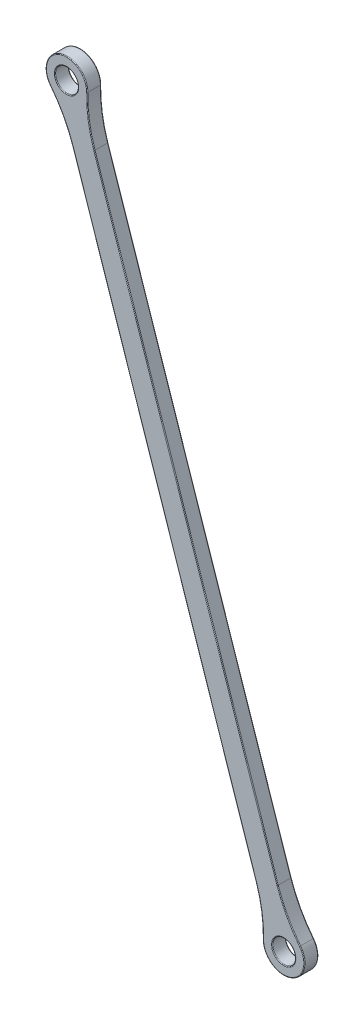
ISO-10303-21;
HEADER;
FILE_DESCRIPTION(('STEP AP214'),'2;1');
FILE_NAME('part.step','',(''),(''),'','','');
FILE_SCHEMA(('AUTOMOTIVE_DESIGN { 1 0 10303 214 1 1 1 1 }'));
ENDSEC;
DATA;
#1=APPLICATION_CONTEXT('core data for automotive mechanical design processes');
#2=APPLICATION_PROTOCOL_DEFINITION('international standard','automotive_design',2000,#1);
#3=PRODUCT_CONTEXT('',#1,'mechanical');
#4=PRODUCT('Part','Part','',(#3));
#5=PRODUCT_RELATED_PRODUCT_CATEGORY('part','',(#4));
#6=PRODUCT_DEFINITION_FORMATION('','',#4);
#7=PRODUCT_DEFINITION_CONTEXT('part definition',#1,'design');
#8=PRODUCT_DEFINITION('design','',#6,#7);
#9=PRODUCT_DEFINITION_SHAPE('','',#8);
#10=(LENGTH_UNIT() NAMED_UNIT(*) SI_UNIT(.MILLI.,.METRE.));
#11=(NAMED_UNIT(*) PLANE_ANGLE_UNIT() SI_UNIT($,.RADIAN.));
#12=(NAMED_UNIT(*) SI_UNIT($,.STERADIAN.) SOLID_ANGLE_UNIT());
#13=UNCERTAINTY_MEASURE_WITH_UNIT(LENGTH_MEASURE(1.E-05),#10,'distance_accuracy_value','');
#14=(GEOMETRIC_REPRESENTATION_CONTEXT(3) GLOBAL_UNCERTAINTY_ASSIGNED_CONTEXT((#13)) GLOBAL_UNIT_ASSIGNED_CONTEXT((#10,
#11,#12)) REPRESENTATION_CONTEXT('',''));
#15=CARTESIAN_POINT('',(0.,0.,0.));
#16=DIRECTION('',(0.,0.,1.));
#17=DIRECTION('',(1.,0.,0.));
#18=AXIS2_PLACEMENT_3D('',#15,#16,#17);
#19=CARTESIAN_POINT('',(35.2762578259127,11.8603454086036,-3.));
#20=DIRECTION('',(0.947861187581984,0.318683493572653,0.));
#21=DIRECTION('',(-0.318683493572653,0.947861187581984,0.));
#22=AXIS2_PLACEMENT_3D('',#19,#20,#21);
#23=PLANE('',#22);
#24=DIRECTION('',(0.,0.,1.));
#25=VECTOR('',#24,1.);
#26=CARTESIAN_POINT('',(-31.3457818724992,210.014460514268,-3.));
#27=LINE('',#26,#25);
#28=CARTESIAN_POINT('',(-31.3457818724992,210.014460514268,-0.15));
#29=VERTEX_POINT('',#28);
#30=CARTESIAN_POINT('',(-31.3457818724992,210.014460514268,-2.85));
#31=VERTEX_POINT('',#30);
#32=EDGE_CURVE('E262',#29,#31,#27,.F.);
#33=ORIENTED_EDGE('',*,*,#32,.T.);
#34=DIRECTION('',(-0.318683493572653,0.947861187581984,0.));
#35=VECTOR('',#34,1.);
#36=CARTESIAN_POINT('',(35.2762578259127,11.8603454086036,-2.85));
#37=LINE('',#36,#35);
#38=CARTESIAN_POINT('',(8.44131888583659,91.6755777800025,-2.85));
#39=VERTEX_POINT('',#38);
#40=EDGE_CURVE('E213',#31,#39,#37,.F.);
#41=ORIENTED_EDGE('',*,*,#40,.T.);
#42=DIRECTION('',(0.,0.,1.));
#43=VECTOR('',#42,1.);
#44=CARTESIAN_POINT('',(8.44131888583659,91.6755777800025,-3.));
#45=LINE('',#44,#43);
#46=CARTESIAN_POINT('',(8.44131888583659,91.6755777800025,-0.15));
#47=VERTEX_POINT('',#46);
#48=EDGE_CURVE('E308',#39,#47,#45,.T.);
#49=ORIENTED_EDGE('',*,*,#48,.T.);
#50=DIRECTION('',(-0.318683493572653,0.947861187581984,0.));
#51=VECTOR('',#50,1.);
#52=CARTESIAN_POINT('',(-31.3457818724993,210.014460514268,-0.15));
#53=LINE('',#52,#51);
#54=EDGE_CURVE('E211',#47,#29,#53,.T.);
#55=ORIENTED_EDGE('',*,*,#54,.T.);
#56=EDGE_LOOP('',(#33,#41,#49,#55));
#57=FACE_BOUND('',#56,.T.);
#58=ADVANCED_FACE('F35',(#57),#23,.F.);
#59=CARTESIAN_POINT('',(-32.6651570487527,221.783455762134,-3.));
#60=DIRECTION('',(0.,0.,1.));
#61=DIRECTION('',(1.,0.,0.));
#62=AXIS2_PLACEMENT_3D('',#59,#60,#61);
#63=CYLINDRICAL_SURFACE('',#62,4.5);
#64=DIRECTION('',(0.,0.,1.));
#65=VECTOR('',#64,1.);
#66=CARTESIAN_POINT('',(-28.1658722563671,221.703228852635,-3.));
#67=LINE('',#66,#65);
#68=CARTESIAN_POINT('',(-28.1658722563671,221.703228852635,-0.15));
#69=VERTEX_POINT('',#68);
#70=CARTESIAN_POINT('',(-28.1658722563671,221.703228852635,-2.85));
#71=VERTEX_POINT('',#70);
#72=EDGE_CURVE('E322',#69,#71,#67,.F.);
#73=ORIENTED_EDGE('',*,*,#72,.T.);
#74=CARTESIAN_POINT('',(-32.6651570487527,221.783455762134,-2.85));
#75=DIRECTION('',(0.,0.,1.));
#76=DIRECTION('',(1.,0.,0.));
#77=AXIS2_PLACEMENT_3D('',#74,#75,#76);
#78=CIRCLE('',#77,4.5);
#79=CARTESIAN_POINT('',(-36.2020866728231,219.001347059302,-2.85));
#80=VERTEX_POINT('',#79);
#81=EDGE_CURVE('E204',#71,#80,#78,.T.);
#82=ORIENTED_EDGE('',*,*,#81,.T.);
#83=DIRECTION('',(0.,0.,1.));
#84=VECTOR('',#83,1.);
#85=CARTESIAN_POINT('',(-36.2020866728231,219.001347059302,-3.));
#86=LINE('',#85,#84);
#87=CARTESIAN_POINT('',(-36.2020866728231,219.001347059302,-0.15));
#88=VERTEX_POINT('',#87);
#89=EDGE_CURVE('E319',#80,#88,#86,.T.);
#90=ORIENTED_EDGE('',*,*,#89,.T.);
#91=CARTESIAN_POINT('',(-32.6651570487527,221.783455762134,-0.15));
#92=DIRECTION('',(0.,0.,1.));
#93=DIRECTION('',(1.,0.,0.));
#94=AXIS2_PLACEMENT_3D('',#91,#92,#93);
#95=CIRCLE('',#94,4.5);
#96=EDGE_CURVE('E202',#88,#69,#95,.F.);
#97=ORIENTED_EDGE('',*,*,#96,.T.);
#98=EDGE_LOOP('',(#73,#82,#90,#97));
#99=FACE_BOUND('',#98,.T.);
#100=ADVANCED_FACE('F390',(#99),#63,.T.);
#101=CARTESIAN_POINT('',(40.0155637638226,13.4537628764668,-3.));
#102=DIRECTION('',(0.947861187581984,0.318683493572653,0.));
#103=DIRECTION('',(-0.318683493572653,0.947861187581984,0.));
#104=AXIS2_PLACEMENT_3D('',#101,#102,#103);
#105=PLANE('',#104);
#106=DIRECTION('',(0.,0.,-1.));
#107=VECTOR('',#106,1.);
#108=CARTESIAN_POINT('',(13.1806248237466,93.2689952478657,-3.));
#109=LINE('',#108,#107);
#110=CARTESIAN_POINT('',(13.1806248237466,93.2689952478657,-0.15));
#111=VERTEX_POINT('',#110);
#112=CARTESIAN_POINT('',(13.1806248237466,93.2689952478657,-2.85));
#113=VERTEX_POINT('',#112);
#114=EDGE_CURVE('E302',#111,#113,#109,.T.);
#115=ORIENTED_EDGE('',*,*,#114,.T.);
#116=DIRECTION('',(-0.318683493572653,0.947861187581984,0.));
#117=VECTOR('',#116,1.);
#118=CARTESIAN_POINT('',(-26.6064759345894,211.607877982131,-2.85));
#119=LINE('',#118,#117);
#120=CARTESIAN_POINT('',(-26.6064759345893,211.607877982131,-2.85));
#121=VERTEX_POINT('',#120);
#122=EDGE_CURVE('E196',#113,#121,#119,.T.);
#123=ORIENTED_EDGE('',*,*,#122,.T.);
#124=DIRECTION('',(0.,0.,-1.));
#125=VECTOR('',#124,1.);
#126=CARTESIAN_POINT('',(-26.6064759345893,211.607877982131,0.));
#127=LINE('',#126,#125);
#128=CARTESIAN_POINT('',(-26.6064759345893,211.607877982131,-0.15));
#129=VERTEX_POINT('',#128);
#130=EDGE_CURVE('E310',#121,#129,#127,.F.);
#131=ORIENTED_EDGE('',*,*,#130,.T.);
#132=DIRECTION('',(-0.318683493572653,0.947861187581984,0.));
#133=VECTOR('',#132,1.);
#134=CARTESIAN_POINT('',(40.0155637638226,13.4537628764668,-0.15));
#135=LINE('',#134,#133);
#136=EDGE_CURVE('E194',#129,#111,#135,.F.);
#137=ORIENTED_EDGE('',*,*,#136,.T.);
#138=EDGE_LOOP('',(#115,#123,#131,#137));
#139=FACE_BOUND('',#138,.T.);
#140=ADVANCED_FACE('F345',(#139),#105,.T.);
#141=CARTESIAN_POINT('',(14.5,81.5,-3.));
#142=DIRECTION('',(0.,0.,1.));
#143=DIRECTION('',(1.,0.,0.));
#144=AXIS2_PLACEMENT_3D('',#141,#142,#143);
#145=CYLINDRICAL_SURFACE('',#144,4.50000000000001);
#146=DIRECTION('',(0.,0.,1.));
#147=VECTOR('',#146,1.);
#148=CARTESIAN_POINT('',(10.0007152076144,81.5802269094986,-3.));
#149=LINE('',#148,#147);
#150=CARTESIAN_POINT('',(10.0007152076144,81.5802269094986,-0.15));
#151=VERTEX_POINT('',#150);
#152=CARTESIAN_POINT('',(10.0007152076144,81.5802269094986,-2.85));
#153=VERTEX_POINT('',#152);
#154=EDGE_CURVE('E307',#151,#153,#149,.F.);
#155=ORIENTED_EDGE('',*,*,#154,.T.);
#156=CARTESIAN_POINT('',(14.5,81.5,-2.85));
#157=DIRECTION('',(0.,0.,1.));
#158=DIRECTION('',(1.,0.,0.));
#159=AXIS2_PLACEMENT_3D('',#156,#157,#158);
#160=CIRCLE('',#159,4.50000000000001);
#161=CARTESIAN_POINT('',(18.0369296240704,84.282108702832,-2.85));
#162=VERTEX_POINT('',#161);
#163=EDGE_CURVE('E221',#153,#162,#160,.T.);
#164=ORIENTED_EDGE('',*,*,#163,.T.);
#165=DIRECTION('',(0.,0.,1.));
#166=VECTOR('',#165,1.);
#167=CARTESIAN_POINT('',(18.0369296240704,84.282108702832,-3.));
#168=LINE('',#167,#166);
#169=CARTESIAN_POINT('',(18.0369296240704,84.282108702832,-0.15));
#170=VERTEX_POINT('',#169);
#171=EDGE_CURVE('E300',#162,#170,#168,.T.);
#172=ORIENTED_EDGE('',*,*,#171,.T.);
#173=CARTESIAN_POINT('',(14.5,81.5,-0.15));
#174=DIRECTION('',(0.,0.,1.));
#175=DIRECTION('',(1.,0.,0.));
#176=AXIS2_PLACEMENT_3D('',#173,#174,#175);
#177=CIRCLE('',#176,4.50000000000001);
#178=EDGE_CURVE('E219',#170,#151,#177,.F.);
#179=ORIENTED_EDGE('',*,*,#178,.T.);
#180=EDGE_LOOP('',(#155,#164,#172,#179));
#181=FACE_BOUND('',#180,.T.);
#182=ADVANCED_FACE('F305',(#181),#145,.T.);
#183=CARTESIAN_POINT('',(-32.6651570487527,221.783455762134,-3.));
#184=DIRECTION('',(0.,0.,1.));
#185=DIRECTION('',(1.,0.,0.));
#186=AXIS2_PLACEMENT_3D('',#183,#184,#185);
#187=CYLINDRICAL_SURFACE('',#186,2.50000000000001);
#188=CARTESIAN_POINT('',(-32.6651570487527,221.783455762134,-2.85));
#189=DIRECTION('',(0.,0.,1.));
#190=DIRECTION('',(1.,0.,0.));
#191=AXIS2_PLACEMENT_3D('',#188,#189,#190);
#192=CIRCLE('',#191,2.50000000000001);
#193=CARTESIAN_POINT('',(-30.1651570487527,221.783455762134,-2.85));
#194=VERTEX_POINT('',#193);
#195=EDGE_CURVE('E226',#194,#194,#192,.F.);
#196=ORIENTED_EDGE('',*,*,#195,.T.);
#197=EDGE_LOOP('',(#196));
#198=FACE_BOUND('',#197,.T.);
#199=CARTESIAN_POINT('',(-32.6651570487527,221.783455762134,-0.15));
#200=DIRECTION('',(0.,0.,1.));
#201=DIRECTION('',(1.,0.,0.));
#202=AXIS2_PLACEMENT_3D('',#199,#200,#201);
#203=CIRCLE('',#202,2.50000000000001);
#204=CARTESIAN_POINT('',(-30.1651570487527,221.783455762134,-0.15));
#205=VERTEX_POINT('',#204);
#206=EDGE_CURVE('E223',#205,#205,#203,.T.);
#207=ORIENTED_EDGE('',*,*,#206,.T.);
#208=EDGE_LOOP('',(#207));
#209=FACE_BOUND('',#208,.T.);
#210=ADVANCED_FACE('F404',(#198,#209),#187,.F.);
#211=CARTESIAN_POINT('',(14.5,81.5,-3.));
#212=DIRECTION('',(0.,0.,1.));
#213=DIRECTION('',(1.,0.,0.));
#214=AXIS2_PLACEMENT_3D('',#211,#212,#213);
#215=CYLINDRICAL_SURFACE('',#214,2.50000000000001);
#216=CARTESIAN_POINT('',(14.5,81.5,-2.85));
#217=DIRECTION('',(0.,0.,1.));
#218=DIRECTION('',(1.,0.,0.));
#219=AXIS2_PLACEMENT_3D('',#216,#217,#218);
#220=CIRCLE('',#219,2.50000000000001);
#221=CARTESIAN_POINT('',(17.,81.5,-2.85));
#222=VERTEX_POINT('',#221);
#223=EDGE_CURVE('E188',#222,#222,#220,.F.);
#224=ORIENTED_EDGE('',*,*,#223,.T.);
#225=EDGE_LOOP('',(#224));
#226=FACE_BOUND('',#225,.T.);
#227=CARTESIAN_POINT('',(14.5,81.5,-0.15));
#228=DIRECTION('',(0.,0.,1.));
#229=DIRECTION('',(1.,0.,0.));
#230=AXIS2_PLACEMENT_3D('',#227,#228,#229);
#231=CIRCLE('',#230,2.50000000000001);
#232=CARTESIAN_POINT('',(17.,81.5,-0.15));
#233=VERTEX_POINT('',#232);
#234=EDGE_CURVE('E180',#233,#233,#231,.T.);
#235=ORIENTED_EDGE('',*,*,#234,.T.);
#236=EDGE_LOOP('',(#235));
#237=FACE_BOUND('',#236,.T.);
#238=ADVANCED_FACE('F400',(#226,#237),#215,.F.);
#239=CARTESIAN_POINT('',(0.,0.,-3.));
#240=DIRECTION('',(0.,0.,1.));
#241=DIRECTION('',(1.,0.,0.));
#242=AXIS2_PLACEMENT_3D('',#239,#240,#241);
#243=PLANE('',#242);
#244=CARTESIAN_POINT('',(14.5,81.5,-3.));
#245=DIRECTION('',(0.,0.,1.));
#246=DIRECTION('',(1.,0.,0.));
#247=AXIS2_PLACEMENT_3D('',#244,#245,#246);
#248=CIRCLE('',#247,2.65000000000001);
#249=CARTESIAN_POINT('',(17.15,81.5,-3.));
#250=VERTEX_POINT('',#249);
#251=EDGE_CURVE('E177',#250,#250,#248,.T.);
#252=ORIENTED_EDGE('',*,*,#251,.T.);
#253=EDGE_LOOP('',(#252));
#254=FACE_BOUND('',#253,.T.);
#255=DIRECTION('',(-0.318683493572653,0.947861187581984,0.));
#256=VECTOR('',#255,1.);
#257=CARTESIAN_POINT('',(13.0384456456092,93.2211927238299,-3.));
#258=LINE('',#257,#256);
#259=CARTESIAN_POINT('',(-26.7486551127266,211.560075458095,-3.));
#260=VERTEX_POINT('',#259);
#261=CARTESIAN_POINT('',(13.0384456456093,93.2211927238298,-3.));
#262=VERTEX_POINT('',#261);
#263=EDGE_CURVE('E175',#260,#262,#258,.F.);
#264=ORIENTED_EDGE('',*,*,#263,.T.);
#265=CARTESIAN_POINT('',(41.6164604512061,102.829500055045,-3.));
#266=DIRECTION('',(0.,0.,1.));
#267=DIRECTION('',(1.,0.,0.));
#268=AXIS2_PLACEMENT_3D('',#265,#266,#267);
#269=CIRCLE('',#268,30.15);
#270=CARTESIAN_POINT('',(17.9190319699347,84.1893717460709,-3.));
#271=VERTEX_POINT('',#270);
#272=EDGE_CURVE('E155',#262,#271,#269,.T.);
#273=ORIENTED_EDGE('',*,*,#272,.T.);
#274=CARTESIAN_POINT('',(14.5,81.5,-3.));
#275=DIRECTION('',(0.,0.,1.));
#276=DIRECTION('',(1.,0.,0.));
#277=AXIS2_PLACEMENT_3D('',#274,#275,#276);
#278=CIRCLE('',#277,4.35000000000001);
#279=CARTESIAN_POINT('',(10.1506913673606,81.577552679182,-3.));
#280=VERTEX_POINT('',#279);
#281=EDGE_CURVE('E163',#271,#280,#278,.F.);
#282=ORIENTED_EDGE('',*,*,#281,.T.);
#283=CARTESIAN_POINT('',(-19.9945167416229,82.1150729728229,-3.));
#284=DIRECTION('',(0.,0.,1.));
#285=DIRECTION('',(1.,0.,0.));
#286=AXIS2_PLACEMENT_3D('',#283,#284,#285);
#287=CIRCLE('',#286,30.15);
#288=CARTESIAN_POINT('',(8.5834980639739,91.7233803040384,-3.));
#289=VERTEX_POINT('',#288);
#290=EDGE_CURVE('E169',#280,#289,#287,.T.);
#291=ORIENTED_EDGE('',*,*,#290,.T.);
#292=DIRECTION('',(-0.318683493572653,0.947861187581984,0.));
#293=VECTOR('',#292,1.);
#294=CARTESIAN_POINT('',(35.41843700405,11.9081479326395,-3.));
#295=LINE('',#294,#293);
#296=CARTESIAN_POINT('',(-31.2036026943619,210.062263038304,-3.));
#297=VERTEX_POINT('',#296);
#298=EDGE_CURVE('E328',#289,#297,#295,.T.);
#299=ORIENTED_EDGE('',*,*,#298,.T.);
#300=CARTESIAN_POINT('',(-59.7816174999587,200.453955707088,-3.));
#301=DIRECTION('',(0.,0.,1.));
#302=DIRECTION('',(1.,0.,0.));
#303=AXIS2_PLACEMENT_3D('',#300,#301,#302);
#304=CIRCLE('',#303,30.15);
#305=CARTESIAN_POINT('',(-36.0841890186874,219.094084016063,-3.));
#306=VERTEX_POINT('',#305);
#307=EDGE_CURVE('E330',#297,#306,#304,.T.);
#308=ORIENTED_EDGE('',*,*,#307,.T.);
#309=CARTESIAN_POINT('',(-32.6651570487527,221.783455762134,-3.));
#310=DIRECTION('',(0.,0.,1.));
#311=DIRECTION('',(1.,0.,0.));
#312=AXIS2_PLACEMENT_3D('',#309,#310,#311);
#313=CIRCLE('',#312,4.35);
#314=CARTESIAN_POINT('',(-28.3158484161133,221.705903082952,-3.));
#315=VERTEX_POINT('',#314);
#316=EDGE_CURVE('E332',#306,#315,#313,.F.);
#317=ORIENTED_EDGE('',*,*,#316,.T.);
#318=CARTESIAN_POINT('',(1.8293596928702,221.168382789311,-3.));
#319=DIRECTION('',(0.,0.,1.));
#320=DIRECTION('',(1.,0.,0.));
#321=AXIS2_PLACEMENT_3D('',#318,#319,#320);
#322=CIRCLE('',#321,30.15);
#323=EDGE_CURVE('E182',#315,#260,#322,.T.);
#324=ORIENTED_EDGE('',*,*,#323,.T.);
#325=EDGE_LOOP('',(#264,#273,#282,#291,#299,#308,#317,#324));
#326=FACE_BOUND('',#325,.T.);
#327=CARTESIAN_POINT('',(-32.6651570487527,221.783455762134,-3.));
#328=DIRECTION('',(0.,0.,1.));
#329=DIRECTION('',(1.,0.,0.));
#330=AXIS2_PLACEMENT_3D('',#327,#328,#329);
#331=CIRCLE('',#330,2.65000000000001);
#332=CARTESIAN_POINT('',(-30.0151570487527,221.783455762134,-3.));
#333=VERTEX_POINT('',#332);
#334=EDGE_CURVE('E170',#333,#333,#331,.T.);
#335=ORIENTED_EDGE('',*,*,#334,.T.);
#336=EDGE_LOOP('',(#335));
#337=FACE_BOUND('',#336,.T.);
#338=ADVANCED_FACE('F172',(#254,#326,#337),#243,.F.);
#339=CARTESIAN_POINT('',(0.,0.,0.));
#340=DIRECTION('',(0.,0.,1.));
#341=DIRECTION('',(1.,0.,0.));
#342=AXIS2_PLACEMENT_3D('',#339,#340,#341);
#343=PLANE('',#342);
#344=CARTESIAN_POINT('',(14.5,81.5,0.));
#345=DIRECTION('',(0.,0.,1.));
#346=DIRECTION('',(1.,0.,0.));
#347=AXIS2_PLACEMENT_3D('',#344,#345,#346);
#348=CIRCLE('',#347,2.65000000000001);
#349=CARTESIAN_POINT('',(17.15,81.5,0.));
#350=VERTEX_POINT('',#349);
#351=EDGE_CURVE('E11',#350,#350,#348,.F.);
#352=ORIENTED_EDGE('',*,*,#351,.T.);
#353=EDGE_LOOP('',(#352));
#354=FACE_BOUND('',#353,.T.);
#355=CARTESIAN_POINT('',(-32.6651570487527,221.783455762134,0.));
#356=DIRECTION('',(0.,0.,1.));
#357=DIRECTION('',(1.,0.,0.));
#358=AXIS2_PLACEMENT_3D('',#355,#356,#357);
#359=CIRCLE('',#358,4.35);
#360=CARTESIAN_POINT('',(-28.3158484161133,221.705903082952,0.));
#361=VERTEX_POINT('',#360);
#362=CARTESIAN_POINT('',(-36.0841890186874,219.094084016063,0.));
#363=VERTEX_POINT('',#362);
#364=EDGE_CURVE('E52',#361,#363,#359,.T.);
#365=ORIENTED_EDGE('',*,*,#364,.T.);
#366=CARTESIAN_POINT('',(-59.7816174999587,200.453955707088,0.));
#367=DIRECTION('',(0.,0.,1.));
#368=DIRECTION('',(1.,0.,0.));
#369=AXIS2_PLACEMENT_3D('',#366,#367,#368);
#370=CIRCLE('',#369,30.15);
#371=CARTESIAN_POINT('',(-31.2036026943619,210.062263038304,0.));
#372=VERTEX_POINT('',#371);
#373=EDGE_CURVE('E44',#363,#372,#370,.F.);
#374=ORIENTED_EDGE('',*,*,#373,.T.);
#375=DIRECTION('',(-0.318683493572653,0.947861187581984,0.));
#376=VECTOR('',#375,1.);
#377=CARTESIAN_POINT('',(8.58349806397388,91.7233803040384,0.));
#378=LINE('',#377,#376);
#379=CARTESIAN_POINT('',(8.58349806397389,91.7233803040384,0.));
#380=VERTEX_POINT('',#379);
#381=EDGE_CURVE('E232',#372,#380,#378,.F.);
#382=ORIENTED_EDGE('',*,*,#381,.T.);
#383=CARTESIAN_POINT('',(-19.9945167416229,82.1150729728229,0.));
#384=DIRECTION('',(0.,0.,1.));
#385=DIRECTION('',(1.,0.,0.));
#386=AXIS2_PLACEMENT_3D('',#383,#384,#385);
#387=CIRCLE('',#386,30.15);
#388=CARTESIAN_POINT('',(10.1506913673606,81.577552679182,0.));
#389=VERTEX_POINT('',#388);
#390=EDGE_CURVE('E234',#380,#389,#387,.F.);
#391=ORIENTED_EDGE('',*,*,#390,.T.);
#392=CARTESIAN_POINT('',(14.5,81.5,0.));
#393=DIRECTION('',(0.,0.,1.));
#394=DIRECTION('',(1.,0.,0.));
#395=AXIS2_PLACEMENT_3D('',#392,#393,#394);
#396=CIRCLE('',#395,4.35000000000001);
#397=CARTESIAN_POINT('',(17.9190319699347,84.1893717460709,0.));
#398=VERTEX_POINT('',#397);
#399=EDGE_CURVE('E236',#389,#398,#396,.T.);
#400=ORIENTED_EDGE('',*,*,#399,.T.);
#401=CARTESIAN_POINT('',(41.6164604512061,102.829500055045,0.));
#402=DIRECTION('',(0.,0.,1.));
#403=DIRECTION('',(1.,0.,0.));
#404=AXIS2_PLACEMENT_3D('',#401,#402,#403);
#405=CIRCLE('',#404,30.15);
#406=CARTESIAN_POINT('',(13.0384456456092,93.2211927238298,0.));
#407=VERTEX_POINT('',#406);
#408=EDGE_CURVE('E238',#398,#407,#405,.F.);
#409=ORIENTED_EDGE('',*,*,#408,.T.);
#410=DIRECTION('',(-0.318683493572653,0.947861187581984,0.));
#411=VECTOR('',#410,1.);
#412=CARTESIAN_POINT('',(39.8733845856853,13.4059603524309,0.));
#413=LINE('',#412,#411);
#414=CARTESIAN_POINT('',(-26.7486551127266,211.560075458095,0.));
#415=VERTEX_POINT('',#414);
#416=EDGE_CURVE('E240',#407,#415,#413,.T.);
#417=ORIENTED_EDGE('',*,*,#416,.T.);
#418=CARTESIAN_POINT('',(1.8293596928702,221.168382789311,0.));
#419=DIRECTION('',(0.,0.,1.));
#420=DIRECTION('',(1.,0.,0.));
#421=AXIS2_PLACEMENT_3D('',#418,#419,#420);
#422=CIRCLE('',#421,30.15);
#423=EDGE_CURVE('E57',#415,#361,#422,.F.);
#424=ORIENTED_EDGE('',*,*,#423,.T.);
#425=EDGE_LOOP('',(#365,#374,#382,#391,#400,#409,#417,#424));
#426=FACE_BOUND('',#425,.T.);
#427=CARTESIAN_POINT('',(-32.6651570487527,221.783455762134,0.));
#428=DIRECTION('',(0.,0.,1.));
#429=DIRECTION('',(1.,0.,0.));
#430=AXIS2_PLACEMENT_3D('',#427,#428,#429);
#431=CIRCLE('',#430,2.65000000000001);
#432=CARTESIAN_POINT('',(-30.0151570487527,221.783455762134,0.));
#433=VERTEX_POINT('',#432);
#434=EDGE_CURVE('E229',#433,#433,#431,.F.);
#435=ORIENTED_EDGE('',*,*,#434,.T.);
#436=EDGE_LOOP('',(#435));
#437=FACE_BOUND('',#436,.T.);
#438=ADVANCED_FACE('F361',(#354,#426,#437),#343,.T.);
#439=CARTESIAN_POINT('',(-19.9945167416229,82.1150729728229,-3.));
#440=DIRECTION('',(0.,0.,1.));
#441=DIRECTION('',(1.,0.,0.));
#442=AXIS2_PLACEMENT_3D('',#439,#440,#441);
#443=CYLINDRICAL_SURFACE('',#442,30.);
#444=ORIENTED_EDGE('',*,*,#48,.F.);
#445=CARTESIAN_POINT('',(-19.9945167416229,82.1150729728229,-2.85));
#446=DIRECTION('',(0.,0.,1.));
#447=DIRECTION('',(1.,0.,0.));
#448=AXIS2_PLACEMENT_3D('',#445,#446,#447);
#449=CIRCLE('',#448,30.);
#450=EDGE_CURVE('E217',#39,#153,#449,.F.);
#451=ORIENTED_EDGE('',*,*,#450,.T.);
#452=ORIENTED_EDGE('',*,*,#154,.F.);
#453=CARTESIAN_POINT('',(-19.9945167416229,82.1150729728229,-0.15));
#454=DIRECTION('',(0.,0.,1.));
#455=DIRECTION('',(1.,0.,0.));
#456=AXIS2_PLACEMENT_3D('',#453,#454,#455);
#457=CIRCLE('',#456,30.);
#458=EDGE_CURVE('E215',#151,#47,#457,.T.);
#459=ORIENTED_EDGE('',*,*,#458,.T.);
#460=EDGE_LOOP('',(#444,#451,#452,#459));
#461=FACE_BOUND('',#460,.T.);
#462=ADVANCED_FACE('F409',(#461),#443,.F.);
#463=CARTESIAN_POINT('',(41.6164604512061,102.829500055045,-3.));
#464=DIRECTION('',(0.,0.,1.));
#465=DIRECTION('',(1.,0.,0.));
#466=AXIS2_PLACEMENT_3D('',#463,#464,#465);
#467=CYLINDRICAL_SURFACE('',#466,30.);
#468=ORIENTED_EDGE('',*,*,#171,.F.);
#469=CARTESIAN_POINT('',(41.6164604512061,102.829500055045,-2.85));
#470=DIRECTION('',(0.,0.,1.));
#471=DIRECTION('',(1.,0.,0.));
#472=AXIS2_PLACEMENT_3D('',#469,#470,#471);
#473=CIRCLE('',#472,30.);
#474=EDGE_CURVE('E157',#162,#113,#473,.F.);
#475=ORIENTED_EDGE('',*,*,#474,.T.);
#476=ORIENTED_EDGE('',*,*,#114,.F.);
#477=CARTESIAN_POINT('',(41.6164604512061,102.829500055045,-0.15));
#478=DIRECTION('',(0.,0.,1.));
#479=DIRECTION('',(1.,0.,0.));
#480=AXIS2_PLACEMENT_3D('',#477,#478,#479);
#481=CIRCLE('',#480,30.);
#482=EDGE_CURVE('E191',#111,#170,#481,.T.);
#483=ORIENTED_EDGE('',*,*,#482,.T.);
#484=EDGE_LOOP('',(#468,#475,#476,#483));
#485=FACE_BOUND('',#484,.T.);
#486=ADVANCED_FACE('F299',(#485),#467,.F.);
#487=CARTESIAN_POINT('',(1.8293596928702,221.168382789311,-3.));
#488=DIRECTION('',(0.,0.,1.));
#489=DIRECTION('',(1.,0.,0.));
#490=AXIS2_PLACEMENT_3D('',#487,#488,#489);
#491=CYLINDRICAL_SURFACE('',#490,30.);
#492=ORIENTED_EDGE('',*,*,#130,.F.);
#493=CARTESIAN_POINT('',(1.8293596928702,221.168382789311,-2.85));
#494=DIRECTION('',(0.,0.,1.));
#495=DIRECTION('',(1.,0.,0.));
#496=AXIS2_PLACEMENT_3D('',#493,#494,#495);
#497=CIRCLE('',#496,30.);
#498=EDGE_CURVE('E200',#121,#71,#497,.F.);
#499=ORIENTED_EDGE('',*,*,#498,.T.);
#500=ORIENTED_EDGE('',*,*,#72,.F.);
#501=CARTESIAN_POINT('',(1.8293596928702,221.168382789311,-0.15));
#502=DIRECTION('',(0.,0.,1.));
#503=DIRECTION('',(1.,0.,0.));
#504=AXIS2_PLACEMENT_3D('',#501,#502,#503);
#505=CIRCLE('',#504,30.);
#506=EDGE_CURVE('E198',#69,#129,#505,.T.);
#507=ORIENTED_EDGE('',*,*,#506,.T.);
#508=EDGE_LOOP('',(#492,#499,#500,#507));
#509=FACE_BOUND('',#508,.T.);
#510=ADVANCED_FACE('F347',(#509),#491,.F.);
#511=CARTESIAN_POINT('',(-59.7816174999587,200.453955707088,-3.));
#512=DIRECTION('',(0.,0.,1.));
#513=DIRECTION('',(1.,0.,0.));
#514=AXIS2_PLACEMENT_3D('',#511,#512,#513);
#515=CYLINDRICAL_SURFACE('',#514,30.);
#516=ORIENTED_EDGE('',*,*,#89,.F.);
#517=CARTESIAN_POINT('',(-59.7816174999587,200.453955707088,-2.85));
#518=DIRECTION('',(0.,0.,1.));
#519=DIRECTION('',(1.,0.,0.));
#520=AXIS2_PLACEMENT_3D('',#517,#518,#519);
#521=CIRCLE('',#520,30.);
#522=EDGE_CURVE('E209',#80,#31,#521,.F.);
#523=ORIENTED_EDGE('',*,*,#522,.T.);
#524=ORIENTED_EDGE('',*,*,#32,.F.);
#525=CARTESIAN_POINT('',(-59.7816174999587,200.453955707088,-0.15));
#526=DIRECTION('',(0.,0.,1.));
#527=DIRECTION('',(1.,0.,0.));
#528=AXIS2_PLACEMENT_3D('',#525,#526,#527);
#529=CIRCLE('',#528,30.);
#530=EDGE_CURVE('E206',#29,#88,#529,.T.);
#531=ORIENTED_EDGE('',*,*,#530,.T.);
#532=EDGE_LOOP('',(#516,#523,#524,#531));
#533=FACE_BOUND('',#532,.T.);
#534=ADVANCED_FACE('F379',(#533),#515,.F.);
#535=CARTESIAN_POINT('',(14.5,81.5,-2.85));
#536=DIRECTION('',(0.,0.,1.));
#537=DIRECTION('',(1.,0.,0.));
#538=AXIS2_PLACEMENT_3D('',#535,#536,#537);
#539=TOROIDAL_SURFACE('',#538,2.65000000000001,0.15);
#540=ORIENTED_EDGE('',*,*,#223,.F.);
#541=EDGE_LOOP('',(#540));
#542=FACE_BOUND('',#541,.T.);
#543=ORIENTED_EDGE('',*,*,#251,.F.);
#544=EDGE_LOOP('',(#543));
#545=FACE_BOUND('',#544,.T.);
#546=ADVANCED_FACE('F419',(#542,#545),#539,.T.);
#547=CARTESIAN_POINT('',(-59.7816174999587,200.453955707088,-2.85));
#548=DIRECTION('',(0.,0.,1.));
#549=DIRECTION('',(1.,0.,0.));
#550=AXIS2_PLACEMENT_3D('',#547,#548,#549);
#551=TOROIDAL_SURFACE('',#550,30.15,0.15);
#552=CARTESIAN_POINT('',(-31.2036026943619,210.062263038304,-2.85));
#553=DIRECTION('',(0.31868349357273,-0.947861187581958,0.));
#554=DIRECTION('',(0.947861187581958,0.318683493572731,0.));
#555=AXIS2_PLACEMENT_3D('',#552,#553,#554);
#556=CIRCLE('',#555,0.15);
#557=EDGE_CURVE('E256',#31,#297,#556,.T.);
#558=ORIENTED_EDGE('',*,*,#557,.F.);
#559=ORIENTED_EDGE('',*,*,#522,.F.);
#560=CARTESIAN_POINT('',(-36.0841890186874,219.094084016063,-2.85));
#561=DIRECTION('',(-0.618246378407133,0.785984360904506,0.));
#562=DIRECTION('',(-0.785984360904506,-0.618246378407133,0.));
#563=AXIS2_PLACEMENT_3D('',#560,#561,#562);
#564=CIRCLE('',#563,0.15);
#565=EDGE_CURVE('E259',#306,#80,#564,.T.);
#566=ORIENTED_EDGE('',*,*,#565,.F.);
#567=ORIENTED_EDGE('',*,*,#307,.F.);
#568=EDGE_LOOP('',(#558,#559,#566,#567));
#569=FACE_BOUND('',#568,.T.);
#570=ADVANCED_FACE('F383',(#569),#551,.T.);
#571=CARTESIAN_POINT('',(-32.6651570487527,221.783455762134,-2.85));
#572=DIRECTION('',(0.,0.,1.));
#573=DIRECTION('',(1.,0.,0.));
#574=AXIS2_PLACEMENT_3D('',#571,#572,#573);
#575=TOROIDAL_SURFACE('',#574,4.35,0.15);
#576=ORIENTED_EDGE('',*,*,#565,.T.);
#577=ORIENTED_EDGE('',*,*,#81,.F.);
#578=CARTESIAN_POINT('',(-28.3158484161133,221.705903082952,-2.85));
#579=DIRECTION('',(-0.0178282021107148,-0.999841064974579,0.));
#580=DIRECTION('',(0.999841064974579,-0.0178282021107148,0.));
#581=AXIS2_PLACEMENT_3D('',#578,#579,#580);
#582=CIRCLE('',#581,0.15);
#583=EDGE_CURVE('E253',#315,#71,#582,.T.);
#584=ORIENTED_EDGE('',*,*,#583,.F.);
#585=ORIENTED_EDGE('',*,*,#316,.F.);
#586=EDGE_LOOP('',(#576,#577,#584,#585));
#587=FACE_BOUND('',#586,.T.);
#588=ADVANCED_FACE('F388',(#587),#575,.T.);
#589=CARTESIAN_POINT('',(35.41843700405,11.9081479326395,-2.85));
#590=DIRECTION('',(-0.318683493572653,0.947861187581984,0.));
#591=DIRECTION('',(-0.947861187581984,-0.318683493572653,0.));
#592=AXIS2_PLACEMENT_3D('',#589,#590,#591);
#593=CYLINDRICAL_SURFACE('',#592,0.15);
#594=ORIENTED_EDGE('',*,*,#557,.T.);
#595=ORIENTED_EDGE('',*,*,#298,.F.);
#596=CARTESIAN_POINT('',(8.58349806397389,91.7233803040384,-2.85));
#597=DIRECTION('',(0.318683493572651,-0.947861187581985,0.));
#598=DIRECTION('',(0.947861187581985,0.318683493572651,0.));
#599=AXIS2_PLACEMENT_3D('',#596,#597,#598);
#600=CIRCLE('',#599,0.15);
#601=EDGE_CURVE('E250',#39,#289,#600,.T.);
#602=ORIENTED_EDGE('',*,*,#601,.F.);
#603=ORIENTED_EDGE('',*,*,#40,.F.);
#604=EDGE_LOOP('',(#594,#595,#602,#603));
#605=FACE_BOUND('',#604,.T.);
#606=ADVANCED_FACE('F436',(#605),#593,.T.);
#607=CARTESIAN_POINT('',(1.8293596928702,221.168382789311,-2.85));
#608=DIRECTION('',(0.,0.,1.));
#609=DIRECTION('',(1.,0.,0.));
#610=AXIS2_PLACEMENT_3D('',#607,#608,#609);
#611=TOROIDAL_SURFACE('',#610,30.15,0.15);
#612=ORIENTED_EDGE('',*,*,#583,.T.);
#613=ORIENTED_EDGE('',*,*,#498,.F.);
#614=CARTESIAN_POINT('',(-26.7486551127266,211.560075458095,-2.85));
#615=DIRECTION('',(0.318683493572737,-0.947861187581955,0.));
#616=DIRECTION('',(0.947861187581955,0.318683493572737,0.));
#617=AXIS2_PLACEMENT_3D('',#614,#615,#616);
#618=CIRCLE('',#617,0.15);
#619=EDGE_CURVE('E247',#260,#121,#618,.T.);
#620=ORIENTED_EDGE('',*,*,#619,.F.);
#621=ORIENTED_EDGE('',*,*,#323,.F.);
#622=EDGE_LOOP('',(#612,#613,#620,#621));
#623=FACE_BOUND('',#622,.T.);
#624=ADVANCED_FACE('F339',(#623),#611,.T.);
#625=CARTESIAN_POINT('',(-19.9945167416229,82.1150729728229,-2.85));
#626=DIRECTION('',(0.,0.,1.));
#627=DIRECTION('',(1.,0.,0.));
#628=AXIS2_PLACEMENT_3D('',#625,#626,#627);
#629=TOROIDAL_SURFACE('',#628,30.15,0.15);
#630=ORIENTED_EDGE('',*,*,#601,.T.);
#631=ORIENTED_EDGE('',*,*,#290,.F.);
#632=CARTESIAN_POINT('',(10.1506913673606,81.577552679182,-2.85));
#633=DIRECTION('',(-0.0178282021108071,-0.999841064974577,0.));
#634=DIRECTION('',(0.999841064974577,-0.0178282021108071,0.));
#635=AXIS2_PLACEMENT_3D('',#632,#633,#634);
#636=CIRCLE('',#635,0.15);
#637=EDGE_CURVE('E166',#153,#280,#636,.T.);
#638=ORIENTED_EDGE('',*,*,#637,.F.);
#639=ORIENTED_EDGE('',*,*,#450,.F.);
#640=EDGE_LOOP('',(#630,#631,#638,#639));
#641=FACE_BOUND('',#640,.T.);
#642=ADVANCED_FACE('F430',(#641),#629,.T.);
#643=CARTESIAN_POINT('',(39.8733845856853,13.405960352431,-2.85));
#644=DIRECTION('',(0.318683493572653,-0.947861187581984,0.));
#645=DIRECTION('',(0.947861187581984,0.318683493572653,0.));
#646=AXIS2_PLACEMENT_3D('',#643,#644,#645);
#647=CYLINDRICAL_SURFACE('',#646,0.15);
#648=ORIENTED_EDGE('',*,*,#619,.T.);
#649=ORIENTED_EDGE('',*,*,#122,.F.);
#650=CARTESIAN_POINT('',(13.0384456456093,93.2211927238298,-2.85));
#651=DIRECTION('',(0.318683493572658,-0.947861187581982,0.));
#652=DIRECTION('',(0.947861187581982,0.318683493572658,0.));
#653=AXIS2_PLACEMENT_3D('',#650,#651,#652);
#654=CIRCLE('',#653,0.15);
#655=EDGE_CURVE('E160',#262,#113,#654,.T.);
#656=ORIENTED_EDGE('',*,*,#655,.F.);
#657=ORIENTED_EDGE('',*,*,#263,.F.);
#658=EDGE_LOOP('',(#648,#649,#656,#657));
#659=FACE_BOUND('',#658,.T.);
#660=ADVANCED_FACE('F342',(#659),#647,.T.);
#661=CARTESIAN_POINT('',(14.5,81.5,-2.85));
#662=DIRECTION('',(0.,0.,1.));
#663=DIRECTION('',(1.,0.,0.));
#664=AXIS2_PLACEMENT_3D('',#661,#662,#663);
#665=TOROIDAL_SURFACE('',#664,4.35000000000001,0.15);
#666=ORIENTED_EDGE('',*,*,#637,.T.);
#667=ORIENTED_EDGE('',*,*,#281,.F.);
#668=CARTESIAN_POINT('',(17.9190319699347,84.1893717460709,-2.85));
#669=DIRECTION('',(-0.618246378407122,0.785984360904515,0.));
#670=DIRECTION('',(-0.785984360904515,-0.618246378407122,0.));
#671=AXIS2_PLACEMENT_3D('',#668,#669,#670);
#672=CIRCLE('',#671,0.15);
#673=EDGE_CURVE('E151',#162,#271,#672,.T.);
#674=ORIENTED_EDGE('',*,*,#673,.F.);
#675=ORIENTED_EDGE('',*,*,#163,.F.);
#676=EDGE_LOOP('',(#666,#667,#674,#675));
#677=FACE_BOUND('',#676,.T.);
#678=ADVANCED_FACE('F164',(#677),#665,.T.);
#679=CARTESIAN_POINT('',(41.6164604512061,102.829500055045,-2.85));
#680=DIRECTION('',(0.,0.,1.));
#681=DIRECTION('',(1.,0.,0.));
#682=AXIS2_PLACEMENT_3D('',#679,#680,#681);
#683=TOROIDAL_SURFACE('',#682,30.15,0.15);
#684=ORIENTED_EDGE('',*,*,#655,.T.);
#685=ORIENTED_EDGE('',*,*,#474,.F.);
#686=ORIENTED_EDGE('',*,*,#673,.T.);
#687=ORIENTED_EDGE('',*,*,#272,.F.);
#688=EDGE_LOOP('',(#684,#685,#686,#687));
#689=FACE_BOUND('',#688,.T.);
#690=ADVANCED_FACE('F153',(#689),#683,.T.);
#691=CARTESIAN_POINT('',(-32.6651570487527,221.783455762134,-2.85));
#692=DIRECTION('',(0.,0.,1.));
#693=DIRECTION('',(1.,0.,0.));
#694=AXIS2_PLACEMENT_3D('',#691,#692,#693);
#695=TOROIDAL_SURFACE('',#694,2.65000000000001,0.15);
#696=ORIENTED_EDGE('',*,*,#334,.F.);
#697=EDGE_LOOP('',(#696));
#698=FACE_BOUND('',#697,.T.);
#699=ORIENTED_EDGE('',*,*,#195,.F.);
#700=EDGE_LOOP('',(#699));
#701=FACE_BOUND('',#700,.T.);
#702=ADVANCED_FACE('F425',(#698,#701),#695,.T.);
#703=CARTESIAN_POINT('',(14.5,81.5,-0.15));
#704=DIRECTION('',(0.,0.,1.));
#705=DIRECTION('',(1.,0.,0.));
#706=AXIS2_PLACEMENT_3D('',#703,#704,#705);
#707=TOROIDAL_SURFACE('',#706,2.65000000000001,0.15);
#708=ORIENTED_EDGE('',*,*,#351,.F.);
#709=EDGE_LOOP('',(#708));
#710=FACE_BOUND('',#709,.T.);
#711=ORIENTED_EDGE('',*,*,#234,.F.);
#712=EDGE_LOOP('',(#711));
#713=FACE_BOUND('',#712,.T.);
#714=ADVANCED_FACE('F446',(#710,#713),#707,.T.);
#715=CARTESIAN_POINT('',(41.6164604512061,102.829500055045,-0.15));
#716=DIRECTION('',(0.,0.,1.));
#717=DIRECTION('',(1.,0.,0.));
#718=AXIS2_PLACEMENT_3D('',#715,#716,#717);
#719=TOROIDAL_SURFACE('',#718,30.15,0.15);
#720=CARTESIAN_POINT('',(17.9190319699347,84.1893717460709,-0.15));
#721=DIRECTION('',(0.618246378407122,-0.785984360904515,0.));
#722=DIRECTION('',(0.785984360904515,0.618246378407122,0.));
#723=AXIS2_PLACEMENT_3D('',#720,#721,#722);
#724=CIRCLE('',#723,0.15);
#725=EDGE_CURVE('E278',#170,#398,#724,.T.);
#726=ORIENTED_EDGE('',*,*,#725,.F.);
#727=ORIENTED_EDGE('',*,*,#482,.F.);
#728=CARTESIAN_POINT('',(13.0384456456092,93.2211927238298,-0.15));
#729=DIRECTION('',(-0.318683493572644,0.947861187581987,0.));
#730=DIRECTION('',(-0.947861187581987,-0.318683493572644,0.));
#731=AXIS2_PLACEMENT_3D('',#728,#729,#730);
#732=CIRCLE('',#731,0.15);
#733=EDGE_CURVE('E39',#407,#111,#732,.T.);
#734=ORIENTED_EDGE('',*,*,#733,.F.);
#735=ORIENTED_EDGE('',*,*,#408,.F.);
#736=EDGE_LOOP('',(#726,#727,#734,#735));
#737=FACE_BOUND('',#736,.T.);
#738=ADVANCED_FACE('F294',(#737),#719,.T.);
#739=CARTESIAN_POINT('',(39.8733845856853,13.4059603524309,-0.15));
#740=DIRECTION('',(-0.318683493572653,0.947861187581984,0.));
#741=DIRECTION('',(-0.947861187581984,-0.318683493572653,0.));
#742=AXIS2_PLACEMENT_3D('',#739,#740,#741);
#743=CYLINDRICAL_SURFACE('',#742,0.15);
#744=ORIENTED_EDGE('',*,*,#733,.T.);
#745=ORIENTED_EDGE('',*,*,#136,.F.);
#746=CARTESIAN_POINT('',(-26.7486551127266,211.560075458095,-0.15));
#747=DIRECTION('',(-0.31868349357273,0.947861187581958,0.));
#748=DIRECTION('',(-0.947861187581958,-0.318683493572731,0.));
#749=AXIS2_PLACEMENT_3D('',#746,#747,#748);
#750=CIRCLE('',#749,0.15);
#751=EDGE_CURVE('E276',#415,#129,#750,.T.);
#752=ORIENTED_EDGE('',*,*,#751,.F.);
#753=ORIENTED_EDGE('',*,*,#416,.F.);
#754=EDGE_LOOP('',(#744,#745,#752,#753));
#755=FACE_BOUND('',#754,.T.);
#756=ADVANCED_FACE('F289',(#755),#743,.T.);
#757=CARTESIAN_POINT('',(14.5,81.5,-0.15));
#758=DIRECTION('',(0.,0.,1.));
#759=DIRECTION('',(1.,0.,0.));
#760=AXIS2_PLACEMENT_3D('',#757,#758,#759);
#761=TOROIDAL_SURFACE('',#760,4.35000000000001,0.15);
#762=ORIENTED_EDGE('',*,*,#725,.T.);
#763=ORIENTED_EDGE('',*,*,#399,.F.);
#764=CARTESIAN_POINT('',(10.1506913673606,81.577552679182,-0.15));
#765=DIRECTION('',(0.0178282021108071,0.999841064974577,0.));
#766=DIRECTION('',(-0.999841064974577,0.0178282021108071,0.));
#767=AXIS2_PLACEMENT_3D('',#764,#765,#766);
#768=CIRCLE('',#767,0.15);
#769=EDGE_CURVE('E273',#151,#389,#768,.T.);
#770=ORIENTED_EDGE('',*,*,#769,.F.);
#771=ORIENTED_EDGE('',*,*,#178,.F.);
#772=EDGE_LOOP('',(#762,#763,#770,#771));
#773=FACE_BOUND('',#772,.T.);
#774=ADVANCED_FACE('F461',(#773),#761,.T.);
#775=CARTESIAN_POINT('',(1.8293596928702,221.168382789311,-0.15));
#776=DIRECTION('',(0.,0.,1.));
#777=DIRECTION('',(1.,0.,0.));
#778=AXIS2_PLACEMENT_3D('',#775,#776,#777);
#779=TOROIDAL_SURFACE('',#778,30.15,0.15);
#780=ORIENTED_EDGE('',*,*,#751,.T.);
#781=ORIENTED_EDGE('',*,*,#506,.F.);
#782=CARTESIAN_POINT('',(-28.3158484161133,221.705903082952,-0.15));
#783=DIRECTION('',(0.0178282021108994,0.999841064974575,0.));
#784=DIRECTION('',(-0.999841064974575,0.0178282021108994,0.));
#785=AXIS2_PLACEMENT_3D('',#782,#783,#784);
#786=CIRCLE('',#785,0.15);
#787=EDGE_CURVE('E270',#361,#69,#786,.T.);
#788=ORIENTED_EDGE('',*,*,#787,.F.);
#789=ORIENTED_EDGE('',*,*,#423,.F.);
#790=EDGE_LOOP('',(#780,#781,#788,#789));
#791=FACE_BOUND('',#790,.T.);
#792=ADVANCED_FACE('F351',(#791),#779,.T.);
#793=CARTESIAN_POINT('',(-19.9945167416229,82.1150729728229,-0.15));
#794=DIRECTION('',(0.,0.,1.));
#795=DIRECTION('',(1.,0.,0.));
#796=AXIS2_PLACEMENT_3D('',#793,#794,#795);
#797=TOROIDAL_SURFACE('',#796,30.15,0.15);
#798=ORIENTED_EDGE('',*,*,#769,.T.);
#799=ORIENTED_EDGE('',*,*,#390,.F.);
#800=CARTESIAN_POINT('',(8.5834980639739,91.7233803040384,-0.15));
#801=DIRECTION('',(-0.318683493572651,0.947861187581985,0.));
#802=DIRECTION('',(-0.947861187581985,-0.318683493572651,0.));
#803=AXIS2_PLACEMENT_3D('',#800,#801,#802);
#804=CIRCLE('',#803,0.15);
#805=EDGE_CURVE('E267',#47,#380,#804,.T.);
#806=ORIENTED_EDGE('',*,*,#805,.F.);
#807=ORIENTED_EDGE('',*,*,#458,.F.);
#808=EDGE_LOOP('',(#798,#799,#806,#807));
#809=FACE_BOUND('',#808,.T.);
#810=ADVANCED_FACE('F367',(#809),#797,.T.);
#811=CARTESIAN_POINT('',(-32.6651570487527,221.783455762134,-0.15));
#812=DIRECTION('',(0.,0.,1.));
#813=DIRECTION('',(1.,0.,0.));
#814=AXIS2_PLACEMENT_3D('',#811,#812,#813);
#815=TOROIDAL_SURFACE('',#814,4.35,0.15);
#816=ORIENTED_EDGE('',*,*,#787,.T.);
#817=ORIENTED_EDGE('',*,*,#96,.F.);
#818=CARTESIAN_POINT('',(-36.0841890186874,219.094084016063,-0.15));
#819=DIRECTION('',(0.618246378407133,-0.785984360904506,0.));
#820=DIRECTION('',(0.785984360904506,0.618246378407133,0.));
#821=AXIS2_PLACEMENT_3D('',#818,#819,#820);
#822=CIRCLE('',#821,0.15);
#823=EDGE_CURVE('E265',#363,#88,#822,.T.);
#824=ORIENTED_EDGE('',*,*,#823,.F.);
#825=ORIENTED_EDGE('',*,*,#364,.F.);
#826=EDGE_LOOP('',(#816,#817,#824,#825));
#827=FACE_BOUND('',#826,.T.);
#828=ADVANCED_FACE('F354',(#827),#815,.T.);
#829=CARTESIAN_POINT('',(35.41843700405,11.9081479326395,-0.15));
#830=DIRECTION('',(0.318683493572653,-0.947861187581984,0.));
#831=DIRECTION('',(0.947861187581984,0.318683493572653,0.));
#832=AXIS2_PLACEMENT_3D('',#829,#830,#831);
#833=CYLINDRICAL_SURFACE('',#832,0.15);
#834=ORIENTED_EDGE('',*,*,#805,.T.);
#835=ORIENTED_EDGE('',*,*,#381,.F.);
#836=CARTESIAN_POINT('',(-31.2036026943619,210.062263038304,-0.15));
#837=DIRECTION('',(-0.31868349357273,0.947861187581958,0.));
#838=DIRECTION('',(-0.947861187581958,-0.318683493572731,0.));
#839=AXIS2_PLACEMENT_3D('',#836,#837,#838);
#840=CIRCLE('',#839,0.15);
#841=EDGE_CURVE('E263',#29,#372,#840,.T.);
#842=ORIENTED_EDGE('',*,*,#841,.F.);
#843=ORIENTED_EDGE('',*,*,#54,.F.);
#844=EDGE_LOOP('',(#834,#835,#842,#843));
#845=FACE_BOUND('',#844,.T.);
#846=ADVANCED_FACE('F371',(#845),#833,.T.);
#847=CARTESIAN_POINT('',(-59.7816174999587,200.453955707088,-0.15));
#848=DIRECTION('',(0.,0.,1.));
#849=DIRECTION('',(1.,0.,0.));
#850=AXIS2_PLACEMENT_3D('',#847,#848,#849);
#851=TOROIDAL_SURFACE('',#850,30.15,0.15);
#852=ORIENTED_EDGE('',*,*,#823,.T.);
#853=ORIENTED_EDGE('',*,*,#530,.F.);
#854=ORIENTED_EDGE('',*,*,#841,.T.);
#855=ORIENTED_EDGE('',*,*,#373,.F.);
#856=EDGE_LOOP('',(#852,#853,#854,#855));
#857=FACE_BOUND('',#856,.T.);
#858=ADVANCED_FACE('F358',(#857),#851,.T.);
#859=CARTESIAN_POINT('',(-32.6651570487527,221.783455762134,-0.15));
#860=DIRECTION('',(0.,0.,1.));
#861=DIRECTION('',(1.,0.,0.));
#862=AXIS2_PLACEMENT_3D('',#859,#860,#861);
#863=TOROIDAL_SURFACE('',#862,2.65000000000001,0.15);
#864=ORIENTED_EDGE('',*,*,#206,.F.);
#865=EDGE_LOOP('',(#864));
#866=FACE_BOUND('',#865,.T.);
#867=ORIENTED_EDGE('',*,*,#434,.F.);
#868=EDGE_LOOP('',(#867));
#869=FACE_BOUND('',#868,.T.);
#870=ADVANCED_FACE('F37',(#866,#869),#863,.T.);
#871=CLOSED_SHELL('',(#58,#100,#140,#182,#210,#238,#338,#438,#462,#486,#510,#534,#546,#570,#588,
#606,#624,#642,#660,#678,#690,#702,#714,#738,#756,#774,#792,#810,#828,#846,#858,#870));
#872=MANIFOLD_SOLID_BREP('B2',#871);
#873=ADVANCED_BREP_SHAPE_REPRESENTATION('',(#18,#872),#14);
#874=SHAPE_DEFINITION_REPRESENTATION(#9,#873);
ENDSEC;
END-ISO-10303-21;
